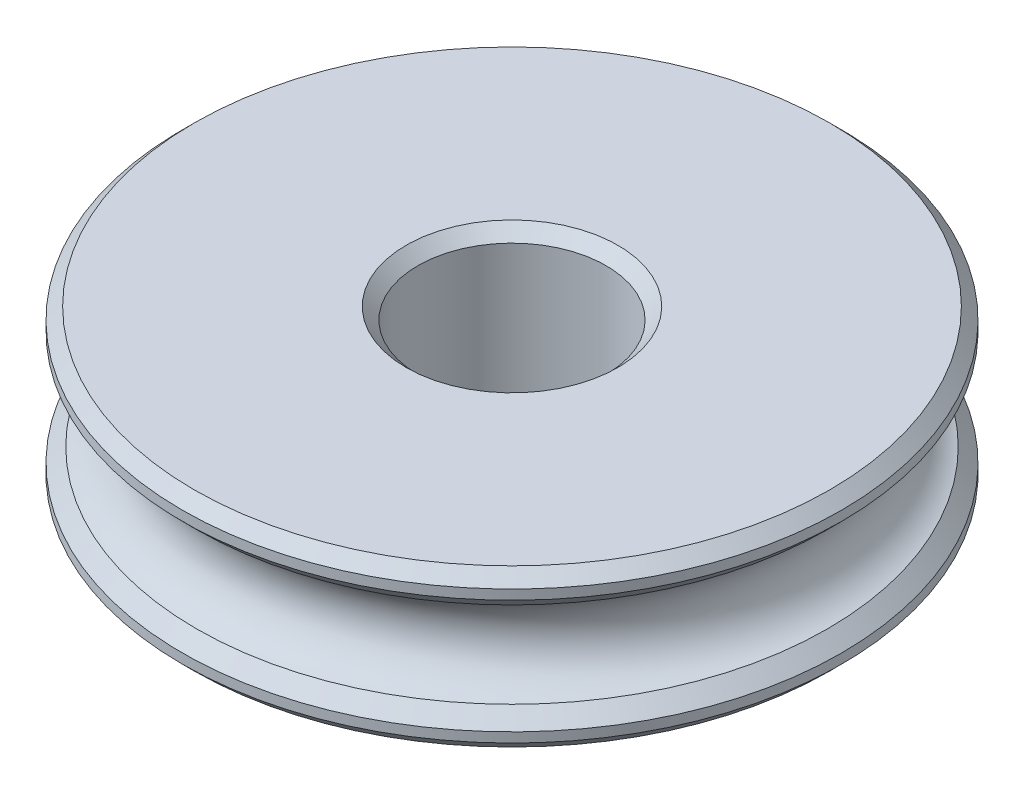
ISO-10303-21;
HEADER;
FILE_DESCRIPTION(('STEP AP214'),'2;1');
FILE_NAME('part.step','',(''),(''),'','','');
FILE_SCHEMA(('AUTOMOTIVE_DESIGN { 1 0 10303 214 1 1 1 1 }'));
ENDSEC;
DATA;
#1=APPLICATION_CONTEXT('core data for automotive mechanical design processes');
#2=APPLICATION_PROTOCOL_DEFINITION('international standard','automotive_design',2000,#1);
#3=PRODUCT_CONTEXT('',#1,'mechanical');
#4=PRODUCT('Part','Part','',(#3));
#5=PRODUCT_RELATED_PRODUCT_CATEGORY('part','',(#4));
#6=PRODUCT_DEFINITION_FORMATION('','',#4);
#7=PRODUCT_DEFINITION_CONTEXT('part definition',#1,'design');
#8=PRODUCT_DEFINITION('design','',#6,#7);
#9=PRODUCT_DEFINITION_SHAPE('','',#8);
#10=(LENGTH_UNIT() NAMED_UNIT(*) SI_UNIT(.MILLI.,.METRE.));
#11=(NAMED_UNIT(*) PLANE_ANGLE_UNIT() SI_UNIT($,.RADIAN.));
#12=(NAMED_UNIT(*) SI_UNIT($,.STERADIAN.) SOLID_ANGLE_UNIT());
#13=UNCERTAINTY_MEASURE_WITH_UNIT(LENGTH_MEASURE(1.E-05),#10,'distance_accuracy_value','');
#14=(GEOMETRIC_REPRESENTATION_CONTEXT(3) GLOBAL_UNCERTAINTY_ASSIGNED_CONTEXT((#13)) GLOBAL_UNIT_ASSIGNED_CONTEXT((#10,
#11,#12)) REPRESENTATION_CONTEXT('',''));
#15=CARTESIAN_POINT('',(0.,0.,0.));
#16=DIRECTION('',(0.,0.,1.));
#17=DIRECTION('',(1.,0.,0.));
#18=AXIS2_PLACEMENT_3D('',#15,#16,#17);
#19=CARTESIAN_POINT('',(0.,10.,0.));
#20=DIRECTION('',(0.,-1.,0.));
#21=DIRECTION('',(0.,0.,-1.));
#22=AXIS2_PLACEMENT_3D('',#19,#20,#21);
#23=CYLINDRICAL_SURFACE('',#22,42.);
#24=CARTESIAN_POINT('',(0.,-8.49999999999999,0.));
#25=DIRECTION('',(0.,1.,0.));
#26=DIRECTION('',(0.,0.,1.));
#27=AXIS2_PLACEMENT_3D('',#24,#25,#26);
#28=CIRCLE('',#27,42.);
#29=CARTESIAN_POINT('',(0.,-8.49999999999999,42.));
#30=VERTEX_POINT('',#29);
#31=EDGE_CURVE('E66',#30,#30,#28,.T.);
#32=ORIENTED_EDGE('',*,*,#31,.T.);
#33=EDGE_LOOP('',(#32));
#34=FACE_BOUND('',#33,.T.);
#35=CARTESIAN_POINT('',(0.,-7.26457725399805,0.));
#36=DIRECTION('',(0.,1.,0.));
#37=DIRECTION('',(-1.,0.,0.));
#38=AXIS2_PLACEMENT_3D('',#35,#36,#37);
#39=CIRCLE('',#38,42.);
#40=CARTESIAN_POINT('',(-42.,-7.264577253998,0.));
#41=VERTEX_POINT('',#40);
#42=EDGE_CURVE('E69',#41,#41,#39,.F.);
#43=ORIENTED_EDGE('',*,*,#42,.T.);
#44=EDGE_LOOP('',(#43));
#45=FACE_BOUND('',#44,.T.);
#46=ADVANCED_FACE('F39',(#34,#45),#23,.T.);
#47=CARTESIAN_POINT('',(0.,7.26457725399803,0.));
#48=DIRECTION('',(0.,-1.,0.));
#49=DIRECTION('',(1.,0.,0.));
#50=AXIS2_PLACEMENT_3D('',#47,#48,#49);
#51=CIRCLE('',#50,42.);
#52=CARTESIAN_POINT('',(42.,7.26457725399797,0.));
#53=VERTEX_POINT('',#52);
#54=EDGE_CURVE('E10',#53,#53,#51,.F.);
#55=ORIENTED_EDGE('',*,*,#54,.T.);
#56=EDGE_LOOP('',(#55));
#57=FACE_BOUND('',#56,.T.);
#58=CARTESIAN_POINT('',(0.,8.5,0.));
#59=DIRECTION('',(0.,1.,0.));
#60=DIRECTION('',(0.,0.,1.));
#61=AXIS2_PLACEMENT_3D('',#58,#59,#60);
#62=CIRCLE('',#61,42.);
#63=CARTESIAN_POINT('',(0.,8.5,42.));
#64=VERTEX_POINT('',#63);
#65=EDGE_CURVE('E47',#64,#64,#62,.F.);
#66=ORIENTED_EDGE('',*,*,#65,.T.);
#67=EDGE_LOOP('',(#66));
#68=FACE_BOUND('',#67,.T.);
#69=ADVANCED_FACE('F107',(#57,#68),#23,.T.);
#70=CARTESIAN_POINT('',(0.,10.,0.));
#71=DIRECTION('',(0.,1.,0.));
#72=DIRECTION('',(0.,0.,1.));
#73=AXIS2_PLACEMENT_3D('',#70,#71,#72);
#74=PLANE('',#73);
#75=CARTESIAN_POINT('',(0.,10.,0.));
#76=DIRECTION('',(0.,1.,0.));
#77=DIRECTION('',(0.,0.,1.));
#78=AXIS2_PLACEMENT_3D('',#75,#76,#77);
#79=CIRCLE('',#78,13.5);
#80=CARTESIAN_POINT('',(0.,10.,13.5));
#81=VERTEX_POINT('',#80);
#82=EDGE_CURVE('E72',#81,#81,#79,.F.);
#83=ORIENTED_EDGE('',*,*,#82,.T.);
#84=EDGE_LOOP('',(#83));
#85=FACE_BOUND('',#84,.T.);
#86=CARTESIAN_POINT('',(0.,10.,0.));
#87=DIRECTION('',(0.,1.,0.));
#88=DIRECTION('',(0.,0.,1.));
#89=AXIS2_PLACEMENT_3D('',#86,#87,#88);
#90=CIRCLE('',#89,40.5);
#91=CARTESIAN_POINT('',(0.,10.,40.5));
#92=VERTEX_POINT('',#91);
#93=EDGE_CURVE('E75',#92,#92,#90,.T.);
#94=ORIENTED_EDGE('',*,*,#93,.T.);
#95=EDGE_LOOP('',(#94));
#96=FACE_BOUND('',#95,.T.);
#97=ADVANCED_FACE('F97',(#85,#96),#74,.T.);
#98=CARTESIAN_POINT('',(0.,-10.,0.));
#99=DIRECTION('',(0.,1.,0.));
#100=DIRECTION('',(0.,0.,1.));
#101=AXIS2_PLACEMENT_3D('',#98,#99,#100);
#102=PLANE('',#101);
#103=CARTESIAN_POINT('',(0.,-10.,0.));
#104=DIRECTION('',(0.,1.,0.));
#105=DIRECTION('',(0.,0.,1.));
#106=AXIS2_PLACEMENT_3D('',#103,#104,#105);
#107=CIRCLE('',#106,40.5);
#108=CARTESIAN_POINT('',(0.,-10.,40.5));
#109=VERTEX_POINT('',#108);
#110=EDGE_CURVE('E60',#109,#109,#107,.F.);
#111=ORIENTED_EDGE('',*,*,#110,.T.);
#112=EDGE_LOOP('',(#111));
#113=FACE_BOUND('',#112,.T.);
#114=CARTESIAN_POINT('',(0.,-10.,0.));
#115=DIRECTION('',(0.,1.,0.));
#116=DIRECTION('',(0.,0.,1.));
#117=AXIS2_PLACEMENT_3D('',#114,#115,#116);
#118=CIRCLE('',#117,13.5);
#119=CARTESIAN_POINT('',(0.,-10.,13.5));
#120=VERTEX_POINT('',#119);
#121=EDGE_CURVE('E63',#120,#120,#118,.T.);
#122=ORIENTED_EDGE('',*,*,#121,.T.);
#123=EDGE_LOOP('',(#122));
#124=FACE_BOUND('',#123,.T.);
#125=ADVANCED_FACE('F95',(#113,#124),#102,.F.);
#126=CARTESIAN_POINT('',(0.,10.,0.));
#127=DIRECTION('',(0.,-1.,0.));
#128=DIRECTION('',(0.,0.,-1.));
#129=AXIS2_PLACEMENT_3D('',#126,#127,#128);
#130=CYLINDRICAL_SURFACE('',#129,12.);
#131=CARTESIAN_POINT('',(0.,8.5,0.));
#132=DIRECTION('',(0.,1.,0.));
#133=DIRECTION('',(0.,0.,1.));
#134=AXIS2_PLACEMENT_3D('',#131,#132,#133);
#135=CIRCLE('',#134,12.);
#136=CARTESIAN_POINT('',(0.,8.5,12.));
#137=VERTEX_POINT('',#136);
#138=EDGE_CURVE('E78',#137,#137,#135,.T.);
#139=ORIENTED_EDGE('',*,*,#138,.T.);
#140=EDGE_LOOP('',(#139));
#141=FACE_BOUND('',#140,.T.);
#142=CARTESIAN_POINT('',(0.,-8.49999999999998,0.));
#143=DIRECTION('',(0.,1.,0.));
#144=DIRECTION('',(0.,0.,1.));
#145=AXIS2_PLACEMENT_3D('',#142,#143,#144);
#146=CIRCLE('',#145,12.);
#147=CARTESIAN_POINT('',(0.,-8.49999999999998,12.));
#148=VERTEX_POINT('',#147);
#149=EDGE_CURVE('E81',#148,#148,#146,.F.);
#150=ORIENTED_EDGE('',*,*,#149,.T.);
#151=EDGE_LOOP('',(#150));
#152=FACE_BOUND('',#151,.T.);
#153=ADVANCED_FACE('F85',(#141,#152),#130,.F.);
#154=CARTESIAN_POINT('',(0.,0.,0.));
#155=DIRECTION('',(0.,-1.,0.));
#156=DIRECTION('',(1.,0.,0.));
#157=AXIS2_PLACEMENT_3D('',#154,#155,#156);
#158=TOROIDAL_SURFACE('',#157,42.,5.76457725399803);
#159=CARTESIAN_POINT('',(0.,-5.48206017744262,0.));
#160=DIRECTION('',(0.,1.,0.));
#161=DIRECTION('',(-1.,0.,0.));
#162=AXIS2_PLACEMENT_3D('',#159,#160,#161);
#163=CIRCLE('',#162,40.2174829234442);
#164=CARTESIAN_POINT('',(-40.2174829234442,-5.48206017744256,0.));
#165=VERTEX_POINT('',#164);
#166=EDGE_CURVE('E51',#165,#165,#163,.T.);
#167=ORIENTED_EDGE('',*,*,#166,.T.);
#168=EDGE_LOOP('',(#167));
#169=FACE_BOUND('',#168,.T.);
#170=CARTESIAN_POINT('',(0.,5.48206017744204,0.));
#171=DIRECTION('',(0.,-1.,0.));
#172=DIRECTION('',(1.,0.,0.));
#173=AXIS2_PLACEMENT_3D('',#170,#171,#172);
#174=CIRCLE('',#173,40.2174829234443);
#175=CARTESIAN_POINT('',(40.2174829234443,5.48206017744198,0.));
#176=VERTEX_POINT('',#175);
#177=EDGE_CURVE('E55',#176,#176,#174,.T.);
#178=ORIENTED_EDGE('',*,*,#177,.T.);
#179=EDGE_LOOP('',(#178));
#180=FACE_BOUND('',#179,.T.);
#181=ADVANCED_FACE('F104',(#169,#180),#158,.F.);
#182=CARTESIAN_POINT('',(0.,8.5,0.));
#183=DIRECTION('',(0.,1.,0.));
#184=DIRECTION('',(0.,0.,1.));
#185=AXIS2_PLACEMENT_3D('',#182,#183,#184);
#186=CONICAL_SURFACE('',#185,12.,0.785398163397448);
#187=ORIENTED_EDGE('',*,*,#82,.F.);
#188=EDGE_LOOP('',(#187));
#189=FACE_BOUND('',#188,.T.);
#190=ORIENTED_EDGE('',*,*,#138,.F.);
#191=EDGE_LOOP('',(#190));
#192=FACE_BOUND('',#191,.T.);
#193=ADVANCED_FACE('F119',(#189,#192),#186,.F.);
#194=CARTESIAN_POINT('',(0.,-8.49999999999999,0.));
#195=DIRECTION('',(0.,1.,0.));
#196=DIRECTION('',(0.,0.,1.));
#197=AXIS2_PLACEMENT_3D('',#194,#195,#196);
#198=CONICAL_SURFACE('',#197,42.,0.785398163397451);
#199=ORIENTED_EDGE('',*,*,#110,.F.);
#200=EDGE_LOOP('',(#199));
#201=FACE_BOUND('',#200,.T.);
#202=ORIENTED_EDGE('',*,*,#31,.F.);
#203=EDGE_LOOP('',(#202));
#204=FACE_BOUND('',#203,.T.);
#205=ADVANCED_FACE('F91',(#201,#204),#198,.T.);
#206=CARTESIAN_POINT('',(0.,-10.,0.));
#207=DIRECTION('',(0.,-1.,0.));
#208=DIRECTION('',(0.,0.,-1.));
#209=AXIS2_PLACEMENT_3D('',#206,#207,#208);
#210=CONICAL_SURFACE('',#209,13.5,0.785398163397444);
#211=ORIENTED_EDGE('',*,*,#149,.F.);
#212=EDGE_LOOP('',(#211));
#213=FACE_BOUND('',#212,.T.);
#214=ORIENTED_EDGE('',*,*,#121,.F.);
#215=EDGE_LOOP('',(#214));
#216=FACE_BOUND('',#215,.T.);
#217=ADVANCED_FACE('F87',(#213,#216),#210,.F.);
#218=CARTESIAN_POINT('',(0.,-7.26457725399805,0.));
#219=DIRECTION('',(0.,-1.,0.));
#220=DIRECTION('',(1.,0.,0.));
#221=AXIS2_PLACEMENT_3D('',#218,#219,#220);
#222=CONICAL_SURFACE('',#221,42.,0.785398163397455);
#223=ORIENTED_EDGE('',*,*,#166,.F.);
#224=EDGE_LOOP('',(#223));
#225=FACE_BOUND('',#224,.T.);
#226=ORIENTED_EDGE('',*,*,#42,.F.);
#227=EDGE_LOOP('',(#226));
#228=FACE_BOUND('',#227,.T.);
#229=ADVANCED_FACE('F90',(#225,#228),#222,.T.);
#230=CARTESIAN_POINT('',(0.,5.48206017744221,0.));
#231=DIRECTION('',(0.,1.,0.));
#232=DIRECTION('',(-1.,0.,0.));
#233=AXIS2_PLACEMENT_3D('',#230,#231,#232);
#234=CONICAL_SURFACE('',#233,40.2174829234442,0.785398163397444);
#235=ORIENTED_EDGE('',*,*,#54,.F.);
#236=EDGE_LOOP('',(#235));
#237=FACE_BOUND('',#236,.T.);
#238=ORIENTED_EDGE('',*,*,#177,.F.);
#239=EDGE_LOOP('',(#238));
#240=FACE_BOUND('',#239,.T.);
#241=ADVANCED_FACE('F139',(#237,#240),#234,.T.);
#242=CARTESIAN_POINT('',(0.,10.,0.));
#243=DIRECTION('',(0.,-1.,0.));
#244=DIRECTION('',(0.,0.,-1.));
#245=AXIS2_PLACEMENT_3D('',#242,#243,#244);
#246=CONICAL_SURFACE('',#245,40.5,0.785398163397451);
#247=ORIENTED_EDGE('',*,*,#65,.F.);
#248=EDGE_LOOP('',(#247));
#249=FACE_BOUND('',#248,.T.);
#250=ORIENTED_EDGE('',*,*,#93,.F.);
#251=EDGE_LOOP('',(#250));
#252=FACE_BOUND('',#251,.T.);
#253=ADVANCED_FACE('F42',(#249,#252),#246,.T.);
#254=CLOSED_SHELL('',(#46,#69,#97,#125,#153,#181,#193,#205,#217,#229,#241,#253));
#255=MANIFOLD_SOLID_BREP('B2',#254);
#256=ADVANCED_BREP_SHAPE_REPRESENTATION('',(#18,#255),#14);
#257=SHAPE_DEFINITION_REPRESENTATION(#9,#256);
ENDSEC;
END-ISO-10303-21;
